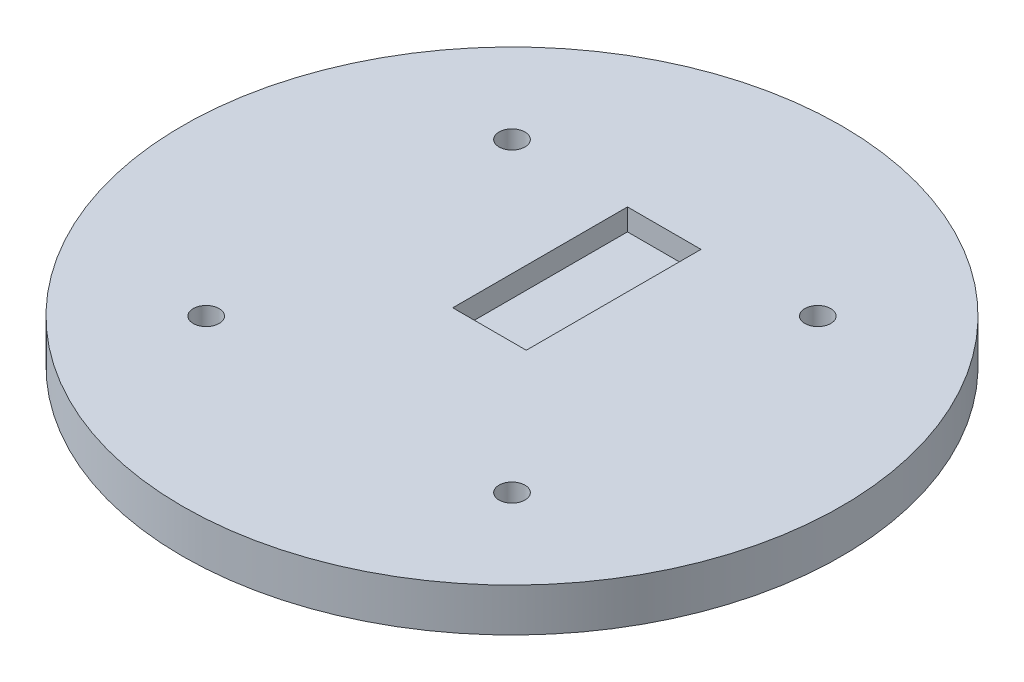
ISO-10303-21;
HEADER;
FILE_DESCRIPTION(('STEP AP214'),'2;1');
FILE_NAME('part.step','',(''),(''),'','','');
FILE_SCHEMA(('AUTOMOTIVE_DESIGN { 1 0 10303 214 1 1 1 1 }'));
ENDSEC;
DATA;
#1=APPLICATION_CONTEXT('core data for automotive mechanical design processes');
#2=APPLICATION_PROTOCOL_DEFINITION('international standard','automotive_design',2000,#1);
#3=PRODUCT_CONTEXT('',#1,'mechanical');
#4=PRODUCT('Part','Part','',(#3));
#5=PRODUCT_RELATED_PRODUCT_CATEGORY('part','',(#4));
#6=PRODUCT_DEFINITION_FORMATION('','',#4);
#7=PRODUCT_DEFINITION_CONTEXT('part definition',#1,'design');
#8=PRODUCT_DEFINITION('design','',#6,#7);
#9=PRODUCT_DEFINITION_SHAPE('','',#8);
#10=(LENGTH_UNIT() NAMED_UNIT(*) SI_UNIT(.MILLI.,.METRE.));
#11=(NAMED_UNIT(*) PLANE_ANGLE_UNIT() SI_UNIT($,.RADIAN.));
#12=(NAMED_UNIT(*) SI_UNIT($,.STERADIAN.) SOLID_ANGLE_UNIT());
#13=UNCERTAINTY_MEASURE_WITH_UNIT(LENGTH_MEASURE(1.E-05),#10,'distance_accuracy_value','');
#14=(GEOMETRIC_REPRESENTATION_CONTEXT(3) GLOBAL_UNCERTAINTY_ASSIGNED_CONTEXT((#13)) GLOBAL_UNIT_ASSIGNED_CONTEXT((#10,
#11,#12)) REPRESENTATION_CONTEXT('',''));
#15=CARTESIAN_POINT('',(0.,0.,0.));
#16=DIRECTION('',(0.,0.,1.));
#17=DIRECTION('',(1.,0.,0.));
#18=AXIS2_PLACEMENT_3D('',#15,#16,#17);
#19=CARTESIAN_POINT('',(0.,2.5,0.));
#20=DIRECTION('',(0.,-1.,0.));
#21=DIRECTION('',(0.,0.,-1.));
#22=AXIS2_PLACEMENT_3D('',#19,#20,#21);
#23=PLANE('',#22);
#24=DIRECTION('',(0.,0.,1.));
#25=VECTOR('',#24,1.);
#26=CARTESIAN_POINT('',(-2.5,2.5,0.600000000000002));
#27=LINE('',#26,#25);
#28=CARTESIAN_POINT('',(-2.5,2.5,0.600000000000002));
#29=VERTEX_POINT('',#28);
#30=CARTESIAN_POINT('',(-2.5,2.5,2.6));
#31=VERTEX_POINT('',#30);
#32=EDGE_CURVE('E104',#29,#31,#27,.T.);
#33=ORIENTED_EDGE('',*,*,#32,.F.);
#34=DIRECTION('',(-1.,0.,0.));
#35=VECTOR('',#34,1.);
#36=CARTESIAN_POINT('',(2.5,2.5,0.600000000000002));
#37=LINE('',#36,#35);
#38=CARTESIAN_POINT('',(2.5,2.5,0.600000000000002));
#39=VERTEX_POINT('',#38);
#40=EDGE_CURVE('E121',#39,#29,#37,.T.);
#41=ORIENTED_EDGE('',*,*,#40,.F.);
#42=DIRECTION('',(0.,0.,-1.));
#43=VECTOR('',#42,1.);
#44=CARTESIAN_POINT('',(2.5,2.5,0.600000000000002));
#45=LINE('',#44,#43);
#46=CARTESIAN_POINT('',(2.5,2.5,2.6));
#47=VERTEX_POINT('',#46);
#48=EDGE_CURVE('E48',#47,#39,#45,.T.);
#49=ORIENTED_EDGE('',*,*,#48,.F.);
#50=DIRECTION('',(1.,0.,0.));
#51=VECTOR('',#50,1.);
#52=CARTESIAN_POINT('',(4.25,2.5,2.6));
#53=LINE('',#52,#51);
#54=CARTESIAN_POINT('',(4.25,2.5,2.6));
#55=VERTEX_POINT('',#54);
#56=EDGE_CURVE('E143',#47,#55,#53,.T.);
#57=ORIENTED_EDGE('',*,*,#56,.T.);
#58=DIRECTION('',(0.,0.,-1.));
#59=VECTOR('',#58,1.);
#60=CARTESIAN_POINT('',(4.25,2.5,-17.6));
#61=LINE('',#60,#59);
#62=CARTESIAN_POINT('',(4.25,2.5,-17.6));
#63=VERTEX_POINT('',#62);
#64=EDGE_CURVE('E147',#55,#63,#61,.T.);
#65=ORIENTED_EDGE('',*,*,#64,.T.);
#66=DIRECTION('',(-1.,0.,0.));
#67=VECTOR('',#66,1.);
#68=CARTESIAN_POINT('',(4.25,2.5,-17.6));
#69=LINE('',#68,#67);
#70=CARTESIAN_POINT('',(-4.25,2.5,-17.6));
#71=VERTEX_POINT('',#70);
#72=EDGE_CURVE('E150',#63,#71,#69,.T.);
#73=ORIENTED_EDGE('',*,*,#72,.T.);
#74=DIRECTION('',(0.,0.,1.));
#75=VECTOR('',#74,1.);
#76=CARTESIAN_POINT('',(-4.25,2.5,-17.6));
#77=LINE('',#76,#75);
#78=CARTESIAN_POINT('',(-4.25,2.5,2.6));
#79=VERTEX_POINT('',#78);
#80=EDGE_CURVE('E140',#71,#79,#77,.T.);
#81=ORIENTED_EDGE('',*,*,#80,.T.);
#82=EDGE_CURVE('E145',#79,#31,#53,.T.);
#83=ORIENTED_EDGE('',*,*,#82,.T.);
#84=EDGE_LOOP('',(#33,#41,#49,#57,#65,#73,#81,#83));
#85=FACE_BOUND('',#84,.T.);
#86=ADVANCED_FACE('F33',(#85),#23,.F.);
#87=CARTESIAN_POINT('',(0.,5.,0.));
#88=DIRECTION('',(0.,-1.,0.));
#89=DIRECTION('',(0.,0.,-1.));
#90=AXIS2_PLACEMENT_3D('',#87,#88,#89);
#91=CYLINDRICAL_SURFACE('',#90,38.1);
#92=CARTESIAN_POINT('',(0.,5.,0.));
#93=DIRECTION('',(0.,1.,0.));
#94=DIRECTION('',(0.,0.,1.));
#95=AXIS2_PLACEMENT_3D('',#92,#93,#94);
#96=CIRCLE('',#95,38.1);
#97=CARTESIAN_POINT('',(0.,5.,38.1));
#98=VERTEX_POINT('',#97);
#99=EDGE_CURVE('E11',#98,#98,#96,.T.);
#100=ORIENTED_EDGE('',*,*,#99,.F.);
#101=EDGE_LOOP('',(#100));
#102=FACE_BOUND('',#101,.T.);
#103=CARTESIAN_POINT('',(0.,0.,0.));
#104=DIRECTION('',(0.,1.,0.));
#105=DIRECTION('',(0.,0.,1.));
#106=AXIS2_PLACEMENT_3D('',#103,#104,#105);
#107=CIRCLE('',#106,38.1);
#108=CARTESIAN_POINT('',(0.,0.,38.1));
#109=VERTEX_POINT('',#108);
#110=EDGE_CURVE('E37',#109,#109,#107,.T.);
#111=ORIENTED_EDGE('',*,*,#110,.T.);
#112=EDGE_LOOP('',(#111));
#113=FACE_BOUND('',#112,.T.);
#114=ADVANCED_FACE('F35',(#102,#113),#91,.T.);
#115=CARTESIAN_POINT('',(0.,5.,0.));
#116=DIRECTION('',(0.,1.,0.));
#117=DIRECTION('',(0.,0.,1.));
#118=AXIS2_PLACEMENT_3D('',#115,#116,#117);
#119=PLANE('',#118);
#120=CARTESIAN_POINT('',(17.6776695296638,5.,17.6776695296636));
#121=DIRECTION('',(0.,1.,0.));
#122=DIRECTION('',(0.,0.,1.));
#123=AXIS2_PLACEMENT_3D('',#120,#121,#122);
#124=CIRCLE('',#123,1.5);
#125=CARTESIAN_POINT('',(17.6776695296638,5.,19.1776695296636));
#126=VERTEX_POINT('',#125);
#127=EDGE_CURVE('E261',#126,#126,#124,.T.);
#128=ORIENTED_EDGE('',*,*,#127,.F.);
#129=EDGE_LOOP('',(#128));
#130=FACE_BOUND('',#129,.T.);
#131=CARTESIAN_POINT('',(-17.6776695296637,5.,17.6776695296637));
#132=DIRECTION('',(0.,1.,0.));
#133=DIRECTION('',(0.,0.,1.));
#134=AXIS2_PLACEMENT_3D('',#131,#132,#133);
#135=CIRCLE('',#134,1.5);
#136=CARTESIAN_POINT('',(-17.6776695296637,5.,19.1776695296637));
#137=VERTEX_POINT('',#136);
#138=EDGE_CURVE('E255',#137,#137,#135,.T.);
#139=ORIENTED_EDGE('',*,*,#138,.F.);
#140=EDGE_LOOP('',(#139));
#141=FACE_BOUND('',#140,.T.);
#142=CARTESIAN_POINT('',(-17.6776695296638,5.,-17.6776695296636));
#143=DIRECTION('',(0.,1.,0.));
#144=DIRECTION('',(0.,0.,1.));
#145=AXIS2_PLACEMENT_3D('',#142,#143,#144);
#146=CIRCLE('',#145,1.5);
#147=CARTESIAN_POINT('',(-17.6776695296638,5.,-16.1776695296636));
#148=VERTEX_POINT('',#147);
#149=EDGE_CURVE('E249',#148,#148,#146,.T.);
#150=ORIENTED_EDGE('',*,*,#149,.F.);
#151=EDGE_LOOP('',(#150));
#152=FACE_BOUND('',#151,.T.);
#153=CARTESIAN_POINT('',(17.6776695296637,5.,-17.6776695296637));
#154=DIRECTION('',(0.,1.,0.));
#155=DIRECTION('',(0.,0.,1.));
#156=AXIS2_PLACEMENT_3D('',#153,#154,#155);
#157=CIRCLE('',#156,1.5);
#158=CARTESIAN_POINT('',(17.6776695296637,5.,-16.1776695296637));
#159=VERTEX_POINT('',#158);
#160=EDGE_CURVE('E126',#159,#159,#157,.T.);
#161=ORIENTED_EDGE('',*,*,#160,.F.);
#162=EDGE_LOOP('',(#161));
#163=FACE_BOUND('',#162,.T.);
#164=DIRECTION('',(0.,0.,1.));
#165=VECTOR('',#164,1.);
#166=CARTESIAN_POINT('',(-4.25,5.,-17.6));
#167=LINE('',#166,#165);
#168=CARTESIAN_POINT('',(-4.25,5.,-17.6));
#169=VERTEX_POINT('',#168);
#170=CARTESIAN_POINT('',(-4.25,5.,2.6));
#171=VERTEX_POINT('',#170);
#172=EDGE_CURVE('E136',#169,#171,#167,.T.);
#173=ORIENTED_EDGE('',*,*,#172,.F.);
#174=DIRECTION('',(-1.,0.,0.));
#175=VECTOR('',#174,1.);
#176=CARTESIAN_POINT('',(4.25,5.,-17.6));
#177=LINE('',#176,#175);
#178=CARTESIAN_POINT('',(4.25,5.,-17.6));
#179=VERTEX_POINT('',#178);
#180=EDGE_CURVE('E144',#179,#169,#177,.T.);
#181=ORIENTED_EDGE('',*,*,#180,.F.);
#182=DIRECTION('',(0.,0.,-1.));
#183=VECTOR('',#182,1.);
#184=CARTESIAN_POINT('',(4.25,5.,-17.6));
#185=LINE('',#184,#183);
#186=CARTESIAN_POINT('',(4.25,5.,2.6));
#187=VERTEX_POINT('',#186);
#188=EDGE_CURVE('E157',#187,#179,#185,.T.);
#189=ORIENTED_EDGE('',*,*,#188,.F.);
#190=DIRECTION('',(1.,0.,0.));
#191=VECTOR('',#190,1.);
#192=CARTESIAN_POINT('',(4.25,5.,2.6));
#193=LINE('',#192,#191);
#194=EDGE_CURVE('E155',#171,#187,#193,.T.);
#195=ORIENTED_EDGE('',*,*,#194,.F.);
#196=EDGE_LOOP('',(#173,#181,#189,#195));
#197=FACE_BOUND('',#196,.T.);
#198=ORIENTED_EDGE('',*,*,#99,.T.);
#199=EDGE_LOOP('',(#198));
#200=FACE_BOUND('',#199,.T.);
#201=ADVANCED_FACE('F176',(#130,#141,#152,#163,#197,#200),#119,.T.);
#202=CARTESIAN_POINT('',(0.,0.,0.));
#203=DIRECTION('',(0.,1.,0.));
#204=DIRECTION('',(0.,0.,1.));
#205=AXIS2_PLACEMENT_3D('',#202,#203,#204);
#206=PLANE('',#205);
#207=CARTESIAN_POINT('',(0.,0.,-33.1));
#208=DIRECTION('',(0.,-1.,0.));
#209=DIRECTION('',(0.,0.,-1.));
#210=AXIS2_PLACEMENT_3D('',#207,#208,#209);
#211=CIRCLE('',#210,2.5);
#212=CARTESIAN_POINT('',(0.,0.,-35.6));
#213=VERTEX_POINT('',#212);
#214=EDGE_CURVE('E227',#213,#213,#211,.T.);
#215=ORIENTED_EDGE('',*,*,#214,.F.);
#216=EDGE_LOOP('',(#215));
#217=FACE_BOUND('',#216,.T.);
#218=CARTESIAN_POINT('',(33.1,0.,0.));
#219=DIRECTION('',(0.,-1.,0.));
#220=DIRECTION('',(0.,0.,-1.));
#221=AXIS2_PLACEMENT_3D('',#218,#219,#220);
#222=CIRCLE('',#221,2.5);
#223=CARTESIAN_POINT('',(33.1,0.,-2.5));
#224=VERTEX_POINT('',#223);
#225=EDGE_CURVE('E231',#224,#224,#222,.T.);
#226=ORIENTED_EDGE('',*,*,#225,.F.);
#227=EDGE_LOOP('',(#226));
#228=FACE_BOUND('',#227,.T.);
#229=CARTESIAN_POINT('',(0.,0.,33.1));
#230=DIRECTION('',(0.,-1.,0.));
#231=DIRECTION('',(0.,0.,-1.));
#232=AXIS2_PLACEMENT_3D('',#229,#230,#231);
#233=CIRCLE('',#232,2.5);
#234=CARTESIAN_POINT('',(0.,0.,30.6));
#235=VERTEX_POINT('',#234);
#236=EDGE_CURVE('E235',#235,#235,#233,.T.);
#237=ORIENTED_EDGE('',*,*,#236,.F.);
#238=EDGE_LOOP('',(#237));
#239=FACE_BOUND('',#238,.T.);
#240=CARTESIAN_POINT('',(-33.1,0.,0.));
#241=DIRECTION('',(0.,-1.,0.));
#242=DIRECTION('',(0.,0.,-1.));
#243=AXIS2_PLACEMENT_3D('',#240,#241,#242);
#244=CIRCLE('',#243,2.5);
#245=CARTESIAN_POINT('',(-33.1,0.,-2.5));
#246=VERTEX_POINT('',#245);
#247=EDGE_CURVE('E238',#246,#246,#244,.T.);
#248=ORIENTED_EDGE('',*,*,#247,.F.);
#249=EDGE_LOOP('',(#248));
#250=FACE_BOUND('',#249,.T.);
#251=DIRECTION('',(-1.,0.,0.));
#252=VECTOR('',#251,1.);
#253=CARTESIAN_POINT('',(2.5,0.,0.600000000000002));
#254=LINE('',#253,#252);
#255=CARTESIAN_POINT('',(2.5,0.,0.600000000000002));
#256=VERTEX_POINT('',#255);
#257=CARTESIAN_POINT('',(-2.5,0.,0.600000000000002));
#258=VERTEX_POINT('',#257);
#259=EDGE_CURVE('E109',#256,#258,#254,.T.);
#260=ORIENTED_EDGE('',*,*,#259,.T.);
#261=DIRECTION('',(0.,0.,1.));
#262=VECTOR('',#261,1.);
#263=CARTESIAN_POINT('',(-2.5,0.,0.600000000000002));
#264=LINE('',#263,#262);
#265=CARTESIAN_POINT('',(-2.5,0.,2.6));
#266=VERTEX_POINT('',#265);
#267=EDGE_CURVE('E101',#258,#266,#264,.T.);
#268=ORIENTED_EDGE('',*,*,#267,.T.);
#269=DIRECTION('',(1.,0.,0.));
#270=VECTOR('',#269,1.);
#271=CARTESIAN_POINT('',(2.5,0.,2.6));
#272=LINE('',#271,#270);
#273=CARTESIAN_POINT('',(2.5,0.,2.6));
#274=VERTEX_POINT('',#273);
#275=EDGE_CURVE('E112',#266,#274,#272,.T.);
#276=ORIENTED_EDGE('',*,*,#275,.T.);
#277=DIRECTION('',(0.,0.,-1.));
#278=VECTOR('',#277,1.);
#279=CARTESIAN_POINT('',(2.5,0.,0.600000000000002));
#280=LINE('',#279,#278);
#281=EDGE_CURVE('E53',#274,#256,#280,.T.);
#282=ORIENTED_EDGE('',*,*,#281,.T.);
#283=EDGE_LOOP('',(#260,#268,#276,#282));
#284=FACE_BOUND('',#283,.T.);
#285=ORIENTED_EDGE('',*,*,#110,.F.);
#286=EDGE_LOOP('',(#285));
#287=FACE_BOUND('',#286,.T.);
#288=ADVANCED_FACE('F118',(#217,#228,#239,#250,#284,#287),#206,.F.);
#289=CARTESIAN_POINT('',(-4.25,2.5,-17.6));
#290=DIRECTION('',(-1.,0.,0.));
#291=DIRECTION('',(0.,0.,1.));
#292=AXIS2_PLACEMENT_3D('',#289,#290,#291);
#293=PLANE('',#292);
#294=ORIENTED_EDGE('',*,*,#172,.T.);
#295=DIRECTION('',(0.,1.,0.));
#296=VECTOR('',#295,1.);
#297=CARTESIAN_POINT('',(-4.25,2.5,2.6));
#298=LINE('',#297,#296);
#299=EDGE_CURVE('E153',#79,#171,#298,.T.);
#300=ORIENTED_EDGE('',*,*,#299,.F.);
#301=ORIENTED_EDGE('',*,*,#80,.F.);
#302=DIRECTION('',(0.,1.,0.));
#303=VECTOR('',#302,1.);
#304=CARTESIAN_POINT('',(-4.25,2.5,-17.6));
#305=LINE('',#304,#303);
#306=EDGE_CURVE('E162',#71,#169,#305,.T.);
#307=ORIENTED_EDGE('',*,*,#306,.T.);
#308=EDGE_LOOP('',(#294,#300,#301,#307));
#309=FACE_BOUND('',#308,.T.);
#310=ADVANCED_FACE('F210',(#309),#293,.F.);
#311=CARTESIAN_POINT('',(4.25,2.5,-17.6));
#312=DIRECTION('',(0.,0.,-1.));
#313=DIRECTION('',(-1.,0.,0.));
#314=AXIS2_PLACEMENT_3D('',#311,#312,#313);
#315=PLANE('',#314);
#316=ORIENTED_EDGE('',*,*,#180,.T.);
#317=ORIENTED_EDGE('',*,*,#306,.F.);
#318=ORIENTED_EDGE('',*,*,#72,.F.);
#319=DIRECTION('',(0.,1.,0.));
#320=VECTOR('',#319,1.);
#321=CARTESIAN_POINT('',(4.25,2.5,-17.6));
#322=LINE('',#321,#320);
#323=EDGE_CURVE('E164',#63,#179,#322,.T.);
#324=ORIENTED_EDGE('',*,*,#323,.T.);
#325=EDGE_LOOP('',(#316,#317,#318,#324));
#326=FACE_BOUND('',#325,.T.);
#327=ADVANCED_FACE('F207',(#326),#315,.F.);
#328=CARTESIAN_POINT('',(4.25,2.5,-17.6));
#329=DIRECTION('',(1.,0.,0.));
#330=DIRECTION('',(0.,0.,-1.));
#331=AXIS2_PLACEMENT_3D('',#328,#329,#330);
#332=PLANE('',#331);
#333=ORIENTED_EDGE('',*,*,#188,.T.);
#334=ORIENTED_EDGE('',*,*,#323,.F.);
#335=ORIENTED_EDGE('',*,*,#64,.F.);
#336=DIRECTION('',(0.,1.,0.));
#337=VECTOR('',#336,1.);
#338=CARTESIAN_POINT('',(4.25,2.5,2.6));
#339=LINE('',#338,#337);
#340=EDGE_CURVE('E166',#55,#187,#339,.T.);
#341=ORIENTED_EDGE('',*,*,#340,.T.);
#342=EDGE_LOOP('',(#333,#334,#335,#341));
#343=FACE_BOUND('',#342,.T.);
#344=ADVANCED_FACE('F180',(#343),#332,.F.);
#345=CARTESIAN_POINT('',(4.25,2.5,2.6));
#346=DIRECTION('',(0.,0.,1.));
#347=DIRECTION('',(1.,0.,0.));
#348=AXIS2_PLACEMENT_3D('',#345,#346,#347);
#349=PLANE('',#348);
#350=ORIENTED_EDGE('',*,*,#194,.T.);
#351=ORIENTED_EDGE('',*,*,#340,.F.);
#352=ORIENTED_EDGE('',*,*,#56,.F.);
#353=DIRECTION('',(0.,1.,0.));
#354=VECTOR('',#353,1.);
#355=CARTESIAN_POINT('',(2.5,0.,2.6));
#356=LINE('',#355,#354);
#357=EDGE_CURVE('E108',#274,#47,#356,.T.);
#358=ORIENTED_EDGE('',*,*,#357,.F.);
#359=ORIENTED_EDGE('',*,*,#275,.F.);
#360=DIRECTION('',(0.,1.,0.));
#361=VECTOR('',#360,1.);
#362=CARTESIAN_POINT('',(-2.5,0.,2.6));
#363=LINE('',#362,#361);
#364=EDGE_CURVE('E97',#266,#31,#363,.T.);
#365=ORIENTED_EDGE('',*,*,#364,.T.);
#366=ORIENTED_EDGE('',*,*,#82,.F.);
#367=ORIENTED_EDGE('',*,*,#299,.T.);
#368=EDGE_LOOP('',(#350,#351,#352,#358,#359,#365,#366,#367));
#369=FACE_BOUND('',#368,.T.);
#370=ADVANCED_FACE('F114',(#369),#349,.F.);
#371=CARTESIAN_POINT('',(-2.5,0.,0.600000000000002));
#372=DIRECTION('',(-1.,0.,0.));
#373=DIRECTION('',(0.,0.,1.));
#374=AXIS2_PLACEMENT_3D('',#371,#372,#373);
#375=PLANE('',#374);
#376=ORIENTED_EDGE('',*,*,#32,.T.);
#377=ORIENTED_EDGE('',*,*,#364,.F.);
#378=ORIENTED_EDGE('',*,*,#267,.F.);
#379=DIRECTION('',(0.,1.,0.));
#380=VECTOR('',#379,1.);
#381=CARTESIAN_POINT('',(-2.5,0.,0.600000000000002));
#382=LINE('',#381,#380);
#383=EDGE_CURVE('E134',#258,#29,#382,.T.);
#384=ORIENTED_EDGE('',*,*,#383,.T.);
#385=EDGE_LOOP('',(#376,#377,#378,#384));
#386=FACE_BOUND('',#385,.T.);
#387=ADVANCED_FACE('F99',(#386),#375,.F.);
#388=CARTESIAN_POINT('',(2.5,0.,0.600000000000002));
#389=DIRECTION('',(0.,0.,-1.));
#390=DIRECTION('',(-1.,0.,0.));
#391=AXIS2_PLACEMENT_3D('',#388,#389,#390);
#392=PLANE('',#391);
#393=ORIENTED_EDGE('',*,*,#40,.T.);
#394=ORIENTED_EDGE('',*,*,#383,.F.);
#395=ORIENTED_EDGE('',*,*,#259,.F.);
#396=DIRECTION('',(0.,1.,0.));
#397=VECTOR('',#396,1.);
#398=CARTESIAN_POINT('',(2.5,0.,0.600000000000002));
#399=LINE('',#398,#397);
#400=EDGE_CURVE('E137',#256,#39,#399,.T.);
#401=ORIENTED_EDGE('',*,*,#400,.T.);
#402=EDGE_LOOP('',(#393,#394,#395,#401));
#403=FACE_BOUND('',#402,.T.);
#404=ADVANCED_FACE('F186',(#403),#392,.F.);
#405=CARTESIAN_POINT('',(2.5,0.,0.600000000000002));
#406=DIRECTION('',(1.,0.,0.));
#407=DIRECTION('',(0.,0.,-1.));
#408=AXIS2_PLACEMENT_3D('',#405,#406,#407);
#409=PLANE('',#408);
#410=ORIENTED_EDGE('',*,*,#48,.T.);
#411=ORIENTED_EDGE('',*,*,#400,.F.);
#412=ORIENTED_EDGE('',*,*,#281,.F.);
#413=ORIENTED_EDGE('',*,*,#357,.T.);
#414=EDGE_LOOP('',(#410,#411,#412,#413));
#415=FACE_BOUND('',#414,.T.);
#416=ADVANCED_FACE('F187',(#415),#409,.F.);
#417=CARTESIAN_POINT('',(17.6776695296637,2.,-17.6776695296637));
#418=DIRECTION('',(0.,1.,0.));
#419=DIRECTION('',(0.,0.,1.));
#420=AXIS2_PLACEMENT_3D('',#417,#418,#419);
#421=CYLINDRICAL_SURFACE('',#420,1.5);
#422=CARTESIAN_POINT('',(17.6776695296637,2.,-17.6776695296637));
#423=DIRECTION('',(0.,1.,0.));
#424=DIRECTION('',(0.,0.,1.));
#425=AXIS2_PLACEMENT_3D('',#422,#423,#424);
#426=CIRCLE('',#425,1.5);
#427=CARTESIAN_POINT('',(17.6776695296637,2.,-16.1776695296637));
#428=VERTEX_POINT('',#427);
#429=EDGE_CURVE('E132',#428,#428,#426,.T.);
#430=ORIENTED_EDGE('',*,*,#429,.F.);
#431=EDGE_LOOP('',(#430));
#432=FACE_BOUND('',#431,.T.);
#433=ORIENTED_EDGE('',*,*,#160,.T.);
#434=EDGE_LOOP('',(#433));
#435=FACE_BOUND('',#434,.T.);
#436=ADVANCED_FACE('F189',(#432,#435),#421,.F.);
#437=CARTESIAN_POINT('',(17.6776695296637,2.,-17.6776695296637));
#438=DIRECTION('',(0.,1.,0.));
#439=DIRECTION('',(0.,0.,1.));
#440=AXIS2_PLACEMENT_3D('',#437,#438,#439);
#441=PLANE('',#440);
#442=ORIENTED_EDGE('',*,*,#429,.T.);
#443=EDGE_LOOP('',(#442));
#444=FACE_BOUND('',#443,.T.);
#445=ADVANCED_FACE('F195',(#444),#441,.T.);
#446=CARTESIAN_POINT('',(-17.6776695296638,2.,-17.6776695296636));
#447=DIRECTION('',(0.,1.,0.));
#448=DIRECTION('',(0.,0.,1.));
#449=AXIS2_PLACEMENT_3D('',#446,#447,#448);
#450=CYLINDRICAL_SURFACE('',#449,1.5);
#451=CARTESIAN_POINT('',(-17.6776695296638,2.,-17.6776695296636));
#452=DIRECTION('',(0.,1.,0.));
#453=DIRECTION('',(0.,0.,1.));
#454=AXIS2_PLACEMENT_3D('',#451,#452,#453);
#455=CIRCLE('',#454,1.5);
#456=CARTESIAN_POINT('',(-17.6776695296638,2.,-16.1776695296636));
#457=VERTEX_POINT('',#456);
#458=EDGE_CURVE('E246',#457,#457,#455,.T.);
#459=ORIENTED_EDGE('',*,*,#458,.F.);
#460=EDGE_LOOP('',(#459));
#461=FACE_BOUND('',#460,.T.);
#462=ORIENTED_EDGE('',*,*,#149,.T.);
#463=EDGE_LOOP('',(#462));
#464=FACE_BOUND('',#463,.T.);
#465=ADVANCED_FACE('F272',(#461,#464),#450,.F.);
#466=CARTESIAN_POINT('',(-17.6776695296638,2.,-17.6776695296636));
#467=DIRECTION('',(0.,1.,0.));
#468=DIRECTION('',(0.,0.,1.));
#469=AXIS2_PLACEMENT_3D('',#466,#467,#468);
#470=PLANE('',#469);
#471=ORIENTED_EDGE('',*,*,#458,.T.);
#472=EDGE_LOOP('',(#471));
#473=FACE_BOUND('',#472,.T.);
#474=ADVANCED_FACE('F277',(#473),#470,.T.);
#475=CARTESIAN_POINT('',(-17.6776695296637,2.,17.6776695296637));
#476=DIRECTION('',(0.,1.,0.));
#477=DIRECTION('',(0.,0.,1.));
#478=AXIS2_PLACEMENT_3D('',#475,#476,#477);
#479=CYLINDRICAL_SURFACE('',#478,1.5);
#480=CARTESIAN_POINT('',(-17.6776695296637,2.,17.6776695296637));
#481=DIRECTION('',(0.,1.,0.));
#482=DIRECTION('',(0.,0.,1.));
#483=AXIS2_PLACEMENT_3D('',#480,#481,#482);
#484=CIRCLE('',#483,1.5);
#485=CARTESIAN_POINT('',(-17.6776695296637,2.,19.1776695296637));
#486=VERTEX_POINT('',#485);
#487=EDGE_CURVE('E252',#486,#486,#484,.T.);
#488=ORIENTED_EDGE('',*,*,#487,.F.);
#489=EDGE_LOOP('',(#488));
#490=FACE_BOUND('',#489,.T.);
#491=ORIENTED_EDGE('',*,*,#138,.T.);
#492=EDGE_LOOP('',(#491));
#493=FACE_BOUND('',#492,.T.);
#494=ADVANCED_FACE('F291',(#490,#493),#479,.F.);
#495=CARTESIAN_POINT('',(-17.6776695296637,2.,17.6776695296637));
#496=DIRECTION('',(0.,1.,0.));
#497=DIRECTION('',(0.,0.,1.));
#498=AXIS2_PLACEMENT_3D('',#495,#496,#497);
#499=PLANE('',#498);
#500=ORIENTED_EDGE('',*,*,#487,.T.);
#501=EDGE_LOOP('',(#500));
#502=FACE_BOUND('',#501,.T.);
#503=ADVANCED_FACE('F285',(#502),#499,.T.);
#504=CARTESIAN_POINT('',(17.6776695296638,2.,17.6776695296636));
#505=DIRECTION('',(0.,1.,0.));
#506=DIRECTION('',(0.,0.,1.));
#507=AXIS2_PLACEMENT_3D('',#504,#505,#506);
#508=CYLINDRICAL_SURFACE('',#507,1.5);
#509=CARTESIAN_POINT('',(17.6776695296638,2.,17.6776695296636));
#510=DIRECTION('',(0.,1.,0.));
#511=DIRECTION('',(0.,0.,1.));
#512=AXIS2_PLACEMENT_3D('',#509,#510,#511);
#513=CIRCLE('',#512,1.5);
#514=CARTESIAN_POINT('',(17.6776695296638,2.,19.1776695296636));
#515=VERTEX_POINT('',#514);
#516=EDGE_CURVE('E258',#515,#515,#513,.T.);
#517=ORIENTED_EDGE('',*,*,#516,.F.);
#518=EDGE_LOOP('',(#517));
#519=FACE_BOUND('',#518,.T.);
#520=ORIENTED_EDGE('',*,*,#127,.T.);
#521=EDGE_LOOP('',(#520));
#522=FACE_BOUND('',#521,.T.);
#523=ADVANCED_FACE('F281',(#519,#522),#508,.F.);
#524=CARTESIAN_POINT('',(17.6776695296638,2.,17.6776695296636));
#525=DIRECTION('',(0.,1.,0.));
#526=DIRECTION('',(0.,0.,1.));
#527=AXIS2_PLACEMENT_3D('',#524,#525,#526);
#528=PLANE('',#527);
#529=ORIENTED_EDGE('',*,*,#516,.T.);
#530=EDGE_LOOP('',(#529));
#531=FACE_BOUND('',#530,.T.);
#532=ADVANCED_FACE('F284',(#531),#528,.T.);
#533=CARTESIAN_POINT('',(-33.1,3.,0.));
#534=DIRECTION('',(0.,-1.,0.));
#535=DIRECTION('',(0.,0.,-1.));
#536=AXIS2_PLACEMENT_3D('',#533,#534,#535);
#537=CYLINDRICAL_SURFACE('',#536,2.5);
#538=CARTESIAN_POINT('',(-33.1,3.,0.));
#539=DIRECTION('',(0.,-1.,0.));
#540=DIRECTION('',(0.,0.,-1.));
#541=AXIS2_PLACEMENT_3D('',#538,#539,#540);
#542=CIRCLE('',#541,2.5);
#543=CARTESIAN_POINT('',(-33.1,3.,-2.5));
#544=VERTEX_POINT('',#543);
#545=EDGE_CURVE('E240',#544,#544,#542,.T.);
#546=ORIENTED_EDGE('',*,*,#545,.F.);
#547=EDGE_LOOP('',(#546));
#548=FACE_BOUND('',#547,.T.);
#549=ORIENTED_EDGE('',*,*,#247,.T.);
#550=EDGE_LOOP('',(#549));
#551=FACE_BOUND('',#550,.T.);
#552=ADVANCED_FACE('F289',(#548,#551),#537,.F.);
#553=CARTESIAN_POINT('',(-33.1,3.,0.));
#554=DIRECTION('',(0.,-1.,0.));
#555=DIRECTION('',(0.,0.,-1.));
#556=AXIS2_PLACEMENT_3D('',#553,#554,#555);
#557=PLANE('',#556);
#558=ORIENTED_EDGE('',*,*,#545,.T.);
#559=EDGE_LOOP('',(#558));
#560=FACE_BOUND('',#559,.T.);
#561=ADVANCED_FACE('F303',(#560),#557,.T.);
#562=CARTESIAN_POINT('',(0.,3.,33.1));
#563=DIRECTION('',(0.,-1.,0.));
#564=DIRECTION('',(0.,0.,-1.));
#565=AXIS2_PLACEMENT_3D('',#562,#563,#564);
#566=CYLINDRICAL_SURFACE('',#565,2.5);
#567=CARTESIAN_POINT('',(0.,3.,33.1));
#568=DIRECTION('',(0.,-1.,0.));
#569=DIRECTION('',(0.,0.,-1.));
#570=AXIS2_PLACEMENT_3D('',#567,#568,#569);
#571=CIRCLE('',#570,2.5);
#572=CARTESIAN_POINT('',(0.,3.,30.6));
#573=VERTEX_POINT('',#572);
#574=EDGE_CURVE('E342',#573,#573,#571,.T.);
#575=ORIENTED_EDGE('',*,*,#574,.F.);
#576=EDGE_LOOP('',(#575));
#577=FACE_BOUND('',#576,.T.);
#578=ORIENTED_EDGE('',*,*,#236,.T.);
#579=EDGE_LOOP('',(#578));
#580=FACE_BOUND('',#579,.T.);
#581=ADVANCED_FACE('F307',(#577,#580),#566,.F.);
#582=CARTESIAN_POINT('',(0.,3.,33.1));
#583=DIRECTION('',(0.,-1.,0.));
#584=DIRECTION('',(0.,0.,-1.));
#585=AXIS2_PLACEMENT_3D('',#582,#583,#584);
#586=PLANE('',#585);
#587=ORIENTED_EDGE('',*,*,#574,.T.);
#588=EDGE_LOOP('',(#587));
#589=FACE_BOUND('',#588,.T.);
#590=ADVANCED_FACE('F311',(#589),#586,.T.);
#591=CARTESIAN_POINT('',(33.1,3.,0.));
#592=DIRECTION('',(0.,-1.,0.));
#593=DIRECTION('',(0.,0.,-1.));
#594=AXIS2_PLACEMENT_3D('',#591,#592,#593);
#595=CYLINDRICAL_SURFACE('',#594,2.5);
#596=CARTESIAN_POINT('',(33.1,3.,0.));
#597=DIRECTION('',(0.,-1.,0.));
#598=DIRECTION('',(0.,0.,-1.));
#599=AXIS2_PLACEMENT_3D('',#596,#597,#598);
#600=CIRCLE('',#599,2.5);
#601=CARTESIAN_POINT('',(33.1,3.,-2.5));
#602=VERTEX_POINT('',#601);
#603=EDGE_CURVE('E336',#602,#602,#600,.T.);
#604=ORIENTED_EDGE('',*,*,#603,.F.);
#605=EDGE_LOOP('',(#604));
#606=FACE_BOUND('',#605,.T.);
#607=ORIENTED_EDGE('',*,*,#225,.T.);
#608=EDGE_LOOP('',(#607));
#609=FACE_BOUND('',#608,.T.);
#610=ADVANCED_FACE('F315',(#606,#609),#595,.F.);
#611=CARTESIAN_POINT('',(33.1,3.,0.));
#612=DIRECTION('',(0.,-1.,0.));
#613=DIRECTION('',(0.,0.,-1.));
#614=AXIS2_PLACEMENT_3D('',#611,#612,#613);
#615=PLANE('',#614);
#616=ORIENTED_EDGE('',*,*,#603,.T.);
#617=EDGE_LOOP('',(#616));
#618=FACE_BOUND('',#617,.T.);
#619=ADVANCED_FACE('F319',(#618),#615,.T.);
#620=CARTESIAN_POINT('',(0.,3.,-33.1));
#621=DIRECTION('',(0.,-1.,0.));
#622=DIRECTION('',(0.,0.,-1.));
#623=AXIS2_PLACEMENT_3D('',#620,#621,#622);
#624=CYLINDRICAL_SURFACE('',#623,2.5);
#625=CARTESIAN_POINT('',(0.,3.,-33.1));
#626=DIRECTION('',(0.,-1.,0.));
#627=DIRECTION('',(0.,0.,-1.));
#628=AXIS2_PLACEMENT_3D('',#625,#626,#627);
#629=CIRCLE('',#628,2.5);
#630=CARTESIAN_POINT('',(0.,3.,-35.6));
#631=VERTEX_POINT('',#630);
#632=EDGE_CURVE('E263',#631,#631,#629,.T.);
#633=ORIENTED_EDGE('',*,*,#632,.F.);
#634=EDGE_LOOP('',(#633));
#635=FACE_BOUND('',#634,.T.);
#636=ORIENTED_EDGE('',*,*,#214,.T.);
#637=EDGE_LOOP('',(#636));
#638=FACE_BOUND('',#637,.T.);
#639=ADVANCED_FACE('F323',(#635,#638),#624,.F.);
#640=CARTESIAN_POINT('',(0.,3.,-33.1));
#641=DIRECTION('',(0.,-1.,0.));
#642=DIRECTION('',(0.,0.,-1.));
#643=AXIS2_PLACEMENT_3D('',#640,#641,#642);
#644=PLANE('',#643);
#645=ORIENTED_EDGE('',*,*,#632,.T.);
#646=EDGE_LOOP('',(#645));
#647=FACE_BOUND('',#646,.T.);
#648=ADVANCED_FACE('F327',(#647),#644,.T.);
#649=CLOSED_SHELL('',(#86,#114,#201,#288,#310,#327,#344,#370,#387,#404,#416,#436,#445,#465,#474,
#494,#503,#523,#532,#552,#561,#581,#590,#610,#619,#639,#648));
#650=MANIFOLD_SOLID_BREP('B2',#649);
#651=ADVANCED_BREP_SHAPE_REPRESENTATION('',(#18,#650),#14);
#652=SHAPE_DEFINITION_REPRESENTATION(#9,#651);
ENDSEC;
END-ISO-10303-21;
